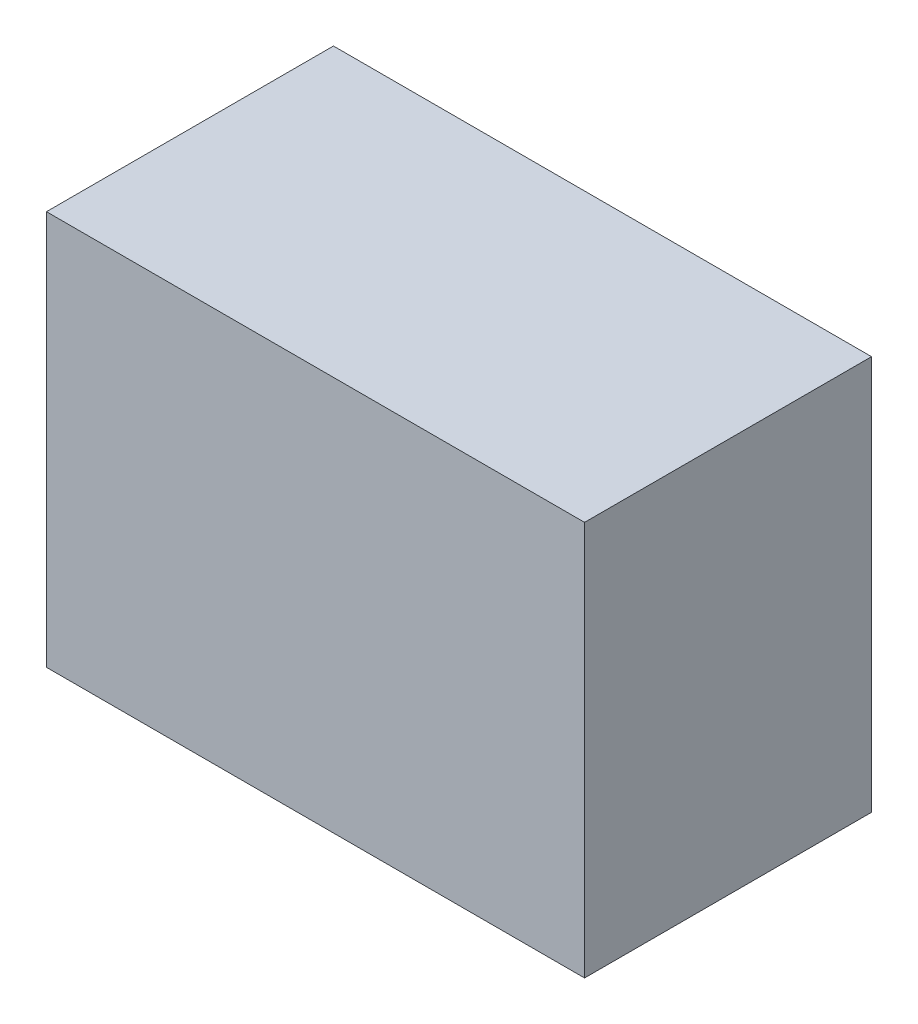
ISO-10303-21;
HEADER;
FILE_DESCRIPTION(('STEP AP214'),'2;1');
FILE_NAME('part.step','',(''),(''),'','','');
FILE_SCHEMA(('AUTOMOTIVE_DESIGN { 1 0 10303 214 1 1 1 1 }'));
ENDSEC;
DATA;
#1=APPLICATION_CONTEXT('core data for automotive mechanical design processes');
#2=APPLICATION_PROTOCOL_DEFINITION('international standard','automotive_design',2000,#1);
#3=PRODUCT_CONTEXT('',#1,'mechanical');
#4=PRODUCT('Part','Part','',(#3));
#5=PRODUCT_RELATED_PRODUCT_CATEGORY('part','',(#4));
#6=PRODUCT_DEFINITION_FORMATION('','',#4);
#7=PRODUCT_DEFINITION_CONTEXT('part definition',#1,'design');
#8=PRODUCT_DEFINITION('design','',#6,#7);
#9=PRODUCT_DEFINITION_SHAPE('','',#8);
#10=(LENGTH_UNIT() NAMED_UNIT(*) SI_UNIT(.MILLI.,.METRE.));
#11=(NAMED_UNIT(*) PLANE_ANGLE_UNIT() SI_UNIT($,.RADIAN.));
#12=(NAMED_UNIT(*) SI_UNIT($,.STERADIAN.) SOLID_ANGLE_UNIT());
#13=UNCERTAINTY_MEASURE_WITH_UNIT(LENGTH_MEASURE(1.E-05),#10,'distance_accuracy_value','');
#14=(GEOMETRIC_REPRESENTATION_CONTEXT(3) GLOBAL_UNCERTAINTY_ASSIGNED_CONTEXT((#13)) GLOBAL_UNIT_ASSIGNED_CONTEXT((#10,
#11,#12)) REPRESENTATION_CONTEXT('',''));
#15=CARTESIAN_POINT('',(0.,0.,0.));
#16=DIRECTION('',(0.,0.,1.));
#17=DIRECTION('',(1.,0.,0.));
#18=AXIS2_PLACEMENT_3D('',#15,#16,#17);
#19=CARTESIAN_POINT('',(0.,9.,-12.));
#20=DIRECTION('',(-1.,0.,0.));
#21=DIRECTION('',(0.,0.,1.));
#22=AXIS2_PLACEMENT_3D('',#19,#20,#21);
#23=CYLINDRICAL_SURFACE('',#22,4.);
#24=CARTESIAN_POINT('',(0.,9.,-12.));
#25=DIRECTION('',(1.,0.,0.));
#26=DIRECTION('',(0.,0.,-1.));
#27=AXIS2_PLACEMENT_3D('',#24,#25,#26);
#28=CIRCLE('',#27,4.);
#29=CARTESIAN_POINT('',(0.,9.,-16.));
#30=VERTEX_POINT('',#29);
#31=EDGE_CURVE('E11',#30,#30,#28,.T.);
#32=ORIENTED_EDGE('',*,*,#31,.F.);
#33=EDGE_LOOP('',(#32));
#34=FACE_BOUND('',#33,.T.);
#35=CARTESIAN_POINT('',(-2.,9.,-12.));
#36=DIRECTION('',(1.,0.,0.));
#37=DIRECTION('',(0.,0.,-1.));
#38=AXIS2_PLACEMENT_3D('',#35,#36,#37);
#39=CIRCLE('',#38,4.);
#40=CARTESIAN_POINT('',(-2.,9.,-16.));
#41=VERTEX_POINT('',#40);
#42=EDGE_CURVE('E59',#41,#41,#39,.T.);
#43=ORIENTED_EDGE('',*,*,#42,.T.);
#44=EDGE_LOOP('',(#43));
#45=FACE_BOUND('',#44,.T.);
#46=ADVANCED_FACE('F54',(#34,#45),#23,.T.);
#47=CARTESIAN_POINT('',(0.,9.,-12.));
#48=DIRECTION('',(1.,0.,0.));
#49=DIRECTION('',(0.,0.,-1.));
#50=AXIS2_PLACEMENT_3D('',#47,#48,#49);
#51=PLANE('',#50);
#52=ORIENTED_EDGE('',*,*,#31,.T.);
#53=EDGE_LOOP('',(#52));
#54=FACE_BOUND('',#53,.T.);
#55=ADVANCED_FACE('F67',(#54),#51,.T.);
#56=CARTESIAN_POINT('',(-2.,9.,-12.));
#57=DIRECTION('',(1.,0.,0.));
#58=DIRECTION('',(0.,0.,-1.));
#59=AXIS2_PLACEMENT_3D('',#56,#57,#58);
#60=PLANE('',#59);
#61=ORIENTED_EDGE('',*,*,#42,.F.);
#62=EDGE_LOOP('',(#61));
#63=FACE_BOUND('',#62,.T.);
#64=ADVANCED_FACE('F66',(#63),#60,.F.);
#65=CLOSED_SHELL('',(#46,#55,#64));
#66=MANIFOLD_SOLID_BREP('B2',#65);
#67=CARTESIAN_POINT('',(0.,33.,-24.));
#68=DIRECTION('',(1.,0.,0.));
#69=DIRECTION('',(0.,0.,-1.));
#70=AXIS2_PLACEMENT_3D('',#67,#68,#69);
#71=PLANE('',#70);
#72=DIRECTION('',(0.,0.,1.));
#73=VECTOR('',#72,1.);
#74=CARTESIAN_POINT('',(0.,0.,-24.));
#75=LINE('',#74,#73);
#76=CARTESIAN_POINT('',(0.,0.,-24.));
#77=VERTEX_POINT('',#76);
#78=CARTESIAN_POINT('',(0.,0.,0.));
#79=VERTEX_POINT('',#78);
#80=EDGE_CURVE('E171',#77,#79,#75,.T.);
#81=ORIENTED_EDGE('',*,*,#80,.T.);
#82=DIRECTION('',(0.,-1.,0.));
#83=VECTOR('',#82,1.);
#84=CARTESIAN_POINT('',(0.,33.,0.));
#85=LINE('',#84,#83);
#86=CARTESIAN_POINT('',(0.,33.,0.));
#87=VERTEX_POINT('',#86);
#88=EDGE_CURVE('E52',#87,#79,#85,.T.);
#89=ORIENTED_EDGE('',*,*,#88,.F.);
#90=DIRECTION('',(0.,0.,1.));
#91=VECTOR('',#90,1.);
#92=CARTESIAN_POINT('',(0.,33.,-24.));
#93=LINE('',#92,#91);
#94=CARTESIAN_POINT('',(0.,33.,-24.));
#95=VERTEX_POINT('',#94);
#96=EDGE_CURVE('E157',#95,#87,#93,.T.);
#97=ORIENTED_EDGE('',*,*,#96,.F.);
#98=DIRECTION('',(0.,-1.,0.));
#99=VECTOR('',#98,1.);
#100=CARTESIAN_POINT('',(0.,33.,-24.));
#101=LINE('',#100,#99);
#102=EDGE_CURVE('E170',#95,#77,#101,.T.);
#103=ORIENTED_EDGE('',*,*,#102,.T.);
#104=EDGE_LOOP('',(#81,#89,#97,#103));
#105=FACE_BOUND('',#104,.T.);
#106=ADVANCED_FACE('F107',(#105),#71,.F.);
#107=CARTESIAN_POINT('',(0.,33.,0.));
#108=DIRECTION('',(0.,0.,-1.));
#109=DIRECTION('',(-1.,0.,0.));
#110=AXIS2_PLACEMENT_3D('',#107,#108,#109);
#111=PLANE('',#110);
#112=DIRECTION('',(1.,0.,0.));
#113=VECTOR('',#112,1.);
#114=CARTESIAN_POINT('',(0.,0.,0.));
#115=LINE('',#114,#113);
#116=CARTESIAN_POINT('',(45.,0.,0.));
#117=VERTEX_POINT('',#116);
#118=EDGE_CURVE('E162',#79,#117,#115,.T.);
#119=ORIENTED_EDGE('',*,*,#118,.T.);
#120=DIRECTION('',(0.,-1.,0.));
#121=VECTOR('',#120,1.);
#122=CARTESIAN_POINT('',(45.,33.,0.));
#123=LINE('',#122,#121);
#124=CARTESIAN_POINT('',(45.,33.,0.));
#125=VERTEX_POINT('',#124);
#126=EDGE_CURVE('E116',#125,#117,#123,.T.);
#127=ORIENTED_EDGE('',*,*,#126,.F.);
#128=DIRECTION('',(1.,0.,0.));
#129=VECTOR('',#128,1.);
#130=CARTESIAN_POINT('',(0.,33.,0.));
#131=LINE('',#130,#129);
#132=EDGE_CURVE('E152',#87,#125,#131,.T.);
#133=ORIENTED_EDGE('',*,*,#132,.F.);
#134=ORIENTED_EDGE('',*,*,#88,.T.);
#135=EDGE_LOOP('',(#119,#127,#133,#134));
#136=FACE_BOUND('',#135,.T.);
#137=ADVANCED_FACE('F165',(#136),#111,.F.);
#138=CARTESIAN_POINT('',(45.,33.,-24.));
#139=DIRECTION('',(-1.,0.,0.));
#140=DIRECTION('',(0.,0.,1.));
#141=AXIS2_PLACEMENT_3D('',#138,#139,#140);
#142=PLANE('',#141);
#143=DIRECTION('',(0.,0.,-1.));
#144=VECTOR('',#143,1.);
#145=CARTESIAN_POINT('',(45.,0.,-24.));
#146=LINE('',#145,#144);
#147=CARTESIAN_POINT('',(45.,0.,-24.));
#148=VERTEX_POINT('',#147);
#149=EDGE_CURVE('E143',#117,#148,#146,.T.);
#150=ORIENTED_EDGE('',*,*,#149,.T.);
#151=DIRECTION('',(0.,-1.,0.));
#152=VECTOR('',#151,1.);
#153=CARTESIAN_POINT('',(45.,33.,-24.));
#154=LINE('',#153,#152);
#155=CARTESIAN_POINT('',(45.,33.,-24.));
#156=VERTEX_POINT('',#155);
#157=EDGE_CURVE('E163',#156,#148,#154,.T.);
#158=ORIENTED_EDGE('',*,*,#157,.F.);
#159=DIRECTION('',(0.,0.,-1.));
#160=VECTOR('',#159,1.);
#161=CARTESIAN_POINT('',(45.,33.,-24.));
#162=LINE('',#161,#160);
#163=EDGE_CURVE('E160',#125,#156,#162,.T.);
#164=ORIENTED_EDGE('',*,*,#163,.F.);
#165=ORIENTED_EDGE('',*,*,#126,.T.);
#166=EDGE_LOOP('',(#150,#158,#164,#165));
#167=FACE_BOUND('',#166,.T.);
#168=ADVANCED_FACE('F164',(#167),#142,.F.);
#169=CARTESIAN_POINT('',(0.,33.,-24.));
#170=DIRECTION('',(0.,0.,1.));
#171=DIRECTION('',(1.,0.,0.));
#172=AXIS2_PLACEMENT_3D('',#169,#170,#171);
#173=PLANE('',#172);
#174=DIRECTION('',(-1.,0.,0.));
#175=VECTOR('',#174,1.);
#176=CARTESIAN_POINT('',(0.,0.,-24.));
#177=LINE('',#176,#175);
#178=EDGE_CURVE('E150',#148,#77,#177,.T.);
#179=ORIENTED_EDGE('',*,*,#178,.T.);
#180=ORIENTED_EDGE('',*,*,#102,.F.);
#181=DIRECTION('',(-1.,0.,0.));
#182=VECTOR('',#181,1.);
#183=CARTESIAN_POINT('',(0.,33.,-24.));
#184=LINE('',#183,#182);
#185=EDGE_CURVE('E124',#156,#95,#184,.T.);
#186=ORIENTED_EDGE('',*,*,#185,.F.);
#187=ORIENTED_EDGE('',*,*,#157,.T.);
#188=EDGE_LOOP('',(#179,#180,#186,#187));
#189=FACE_BOUND('',#188,.T.);
#190=ADVANCED_FACE('F176',(#189),#173,.F.);
#191=CARTESIAN_POINT('',(0.,33.,0.));
#192=DIRECTION('',(0.,1.,0.));
#193=DIRECTION('',(0.,0.,1.));
#194=AXIS2_PLACEMENT_3D('',#191,#192,#193);
#195=PLANE('',#194);
#196=ORIENTED_EDGE('',*,*,#96,.T.);
#197=ORIENTED_EDGE('',*,*,#132,.T.);
#198=ORIENTED_EDGE('',*,*,#163,.T.);
#199=ORIENTED_EDGE('',*,*,#185,.T.);
#200=EDGE_LOOP('',(#196,#197,#198,#199));
#201=FACE_BOUND('',#200,.T.);
#202=ADVANCED_FACE('F154',(#201),#195,.T.);
#203=CARTESIAN_POINT('',(0.,0.,0.));
#204=DIRECTION('',(0.,1.,0.));
#205=DIRECTION('',(0.,0.,1.));
#206=AXIS2_PLACEMENT_3D('',#203,#204,#205);
#207=PLANE('',#206);
#208=ORIENTED_EDGE('',*,*,#80,.F.);
#209=ORIENTED_EDGE('',*,*,#178,.F.);
#210=ORIENTED_EDGE('',*,*,#149,.F.);
#211=ORIENTED_EDGE('',*,*,#118,.F.);
#212=EDGE_LOOP('',(#208,#209,#210,#211));
#213=FACE_BOUND('',#212,.T.);
#214=ADVANCED_FACE('F182',(#213),#207,.F.);
#215=CLOSED_SHELL('',(#106,#137,#168,#190,#202,#214));
#216=MANIFOLD_SOLID_BREP('B6',#215);
#217=ADVANCED_BREP_SHAPE_REPRESENTATION('',(#18,#66,#216),#14);
#218=SHAPE_DEFINITION_REPRESENTATION(#9,#217);
ENDSEC;
END-ISO-10303-21;
